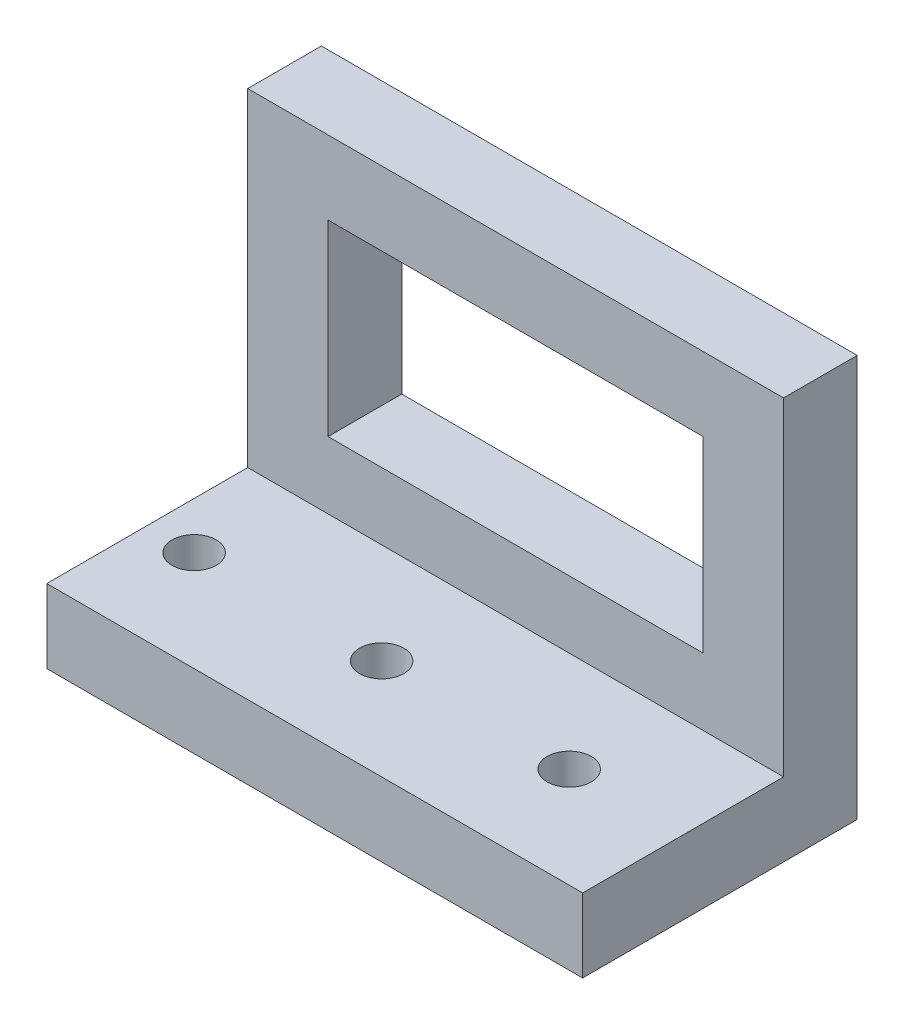
ISO-10303-21;
HEADER;
FILE_DESCRIPTION(('STEP AP214'),'2;1');
FILE_NAME('part.step','',(''),(''),'','','');
FILE_SCHEMA(('AUTOMOTIVE_DESIGN { 1 0 10303 214 1 1 1 1 }'));
ENDSEC;
DATA;
#1=APPLICATION_CONTEXT('core data for automotive mechanical design processes');
#2=APPLICATION_PROTOCOL_DEFINITION('international standard','automotive_design',2000,#1);
#3=PRODUCT_CONTEXT('',#1,'mechanical');
#4=PRODUCT('Part','Part','',(#3));
#5=PRODUCT_RELATED_PRODUCT_CATEGORY('part','',(#4));
#6=PRODUCT_DEFINITION_FORMATION('','',#4);
#7=PRODUCT_DEFINITION_CONTEXT('part definition',#1,'design');
#8=PRODUCT_DEFINITION('design','',#6,#7);
#9=PRODUCT_DEFINITION_SHAPE('','',#8);
#10=(LENGTH_UNIT() NAMED_UNIT(*) SI_UNIT(.MILLI.,.METRE.));
#11=(NAMED_UNIT(*) PLANE_ANGLE_UNIT() SI_UNIT($,.RADIAN.));
#12=(NAMED_UNIT(*) SI_UNIT($,.STERADIAN.) SOLID_ANGLE_UNIT());
#13=UNCERTAINTY_MEASURE_WITH_UNIT(LENGTH_MEASURE(1.E-05),#10,'distance_accuracy_value','');
#14=(GEOMETRIC_REPRESENTATION_CONTEXT(3) GLOBAL_UNCERTAINTY_ASSIGNED_CONTEXT((#13)) GLOBAL_UNIT_ASSIGNED_CONTEXT((#10,
#11,#12)) REPRESENTATION_CONTEXT('',''));
#15=CARTESIAN_POINT('',(0.,0.,0.));
#16=DIRECTION('',(0.,0.,1.));
#17=DIRECTION('',(1.,0.,0.));
#18=AXIS2_PLACEMENT_3D('',#15,#16,#17);
#19=CARTESIAN_POINT('',(-20.2222222222222,10.7222222222222,5.5));
#20=DIRECTION('',(1.,0.,0.));
#21=DIRECTION('',(0.,0.,-1.));
#22=AXIS2_PLACEMENT_3D('',#19,#20,#21);
#23=PLANE('',#22);
#24=DIRECTION('',(0.,-1.,0.));
#25=VECTOR('',#24,1.);
#26=CARTESIAN_POINT('',(-20.2222222222222,10.7222222222222,0.));
#27=LINE('',#26,#25);
#28=CARTESIAN_POINT('',(-20.2222222222222,10.7222222222222,0.));
#29=VERTEX_POINT('',#28);
#30=CARTESIAN_POINT('',(-20.2222222222222,-19.2777777777778,0.));
#31=VERTEX_POINT('',#30);
#32=EDGE_CURVE('E124',#29,#31,#27,.T.);
#33=ORIENTED_EDGE('',*,*,#32,.T.);
#34=DIRECTION('',(0.,0.,-1.));
#35=VECTOR('',#34,1.);
#36=CARTESIAN_POINT('',(-20.2222222222222,-19.2777777777778,5.5));
#37=LINE('',#36,#35);
#38=CARTESIAN_POINT('',(-20.2222222222222,-19.2777777777778,20.5));
#39=VERTEX_POINT('',#38);
#40=EDGE_CURVE('E11',#39,#31,#37,.T.);
#41=ORIENTED_EDGE('',*,*,#40,.F.);
#42=DIRECTION('',(0.,-1.,0.));
#43=VECTOR('',#42,1.);
#44=CARTESIAN_POINT('',(-20.2222222222222,-19.2777777777778,20.5));
#45=LINE('',#44,#43);
#46=CARTESIAN_POINT('',(-20.2222222222222,-13.7777777777778,20.5));
#47=VERTEX_POINT('',#46);
#48=EDGE_CURVE('E121',#47,#39,#45,.T.);
#49=ORIENTED_EDGE('',*,*,#48,.F.);
#50=DIRECTION('',(0.,0.,-1.));
#51=VECTOR('',#50,1.);
#52=CARTESIAN_POINT('',(-20.2222222222222,-13.7777777777778,20.5));
#53=LINE('',#52,#51);
#54=CARTESIAN_POINT('',(-20.2222222222222,-13.7777777777778,5.5));
#55=VERTEX_POINT('',#54);
#56=EDGE_CURVE('E150',#47,#55,#53,.T.);
#57=ORIENTED_EDGE('',*,*,#56,.T.);
#58=DIRECTION('',(0.,-1.,0.));
#59=VECTOR('',#58,1.);
#60=CARTESIAN_POINT('',(-20.2222222222222,10.7222222222222,5.5));
#61=LINE('',#60,#59);
#62=CARTESIAN_POINT('',(-20.2222222222222,10.7222222222222,5.5));
#63=VERTEX_POINT('',#62);
#64=EDGE_CURVE('E200',#63,#55,#61,.T.);
#65=ORIENTED_EDGE('',*,*,#64,.F.);
#66=DIRECTION('',(0.,0.,-1.));
#67=VECTOR('',#66,1.);
#68=CARTESIAN_POINT('',(-20.2222222222222,10.7222222222222,5.5));
#69=LINE('',#68,#67);
#70=EDGE_CURVE('E210',#63,#29,#69,.T.);
#71=ORIENTED_EDGE('',*,*,#70,.T.);
#72=EDGE_LOOP('',(#33,#41,#49,#57,#65,#71));
#73=FACE_BOUND('',#72,.T.);
#74=ADVANCED_FACE('F39',(#73),#23,.F.);
#75=CARTESIAN_POINT('',(-20.2222222222222,-19.2777777777778,5.5));
#76=DIRECTION('',(0.,1.,0.));
#77=DIRECTION('',(0.,0.,1.));
#78=AXIS2_PLACEMENT_3D('',#75,#76,#77);
#79=PLANE('',#78);
#80=CARTESIAN_POINT('',(-16.7222222222222,-19.2777777777778,13.));
#81=DIRECTION('',(0.,-1.,0.));
#82=DIRECTION('',(0.,0.,-1.));
#83=AXIS2_PLACEMENT_3D('',#80,#81,#82);
#84=CIRCLE('',#83,1.65);
#85=CARTESIAN_POINT('',(-16.7222222222222,-19.2777777777778,11.35));
#86=VERTEX_POINT('',#85);
#87=EDGE_CURVE('E233',#86,#86,#84,.T.);
#88=ORIENTED_EDGE('',*,*,#87,.F.);
#89=EDGE_LOOP('',(#88));
#90=FACE_BOUND('',#89,.T.);
#91=CARTESIAN_POINT('',(-2.72222222222221,-19.2777777777778,13.));
#92=DIRECTION('',(0.,-1.,0.));
#93=DIRECTION('',(0.,0.,-1.));
#94=AXIS2_PLACEMENT_3D('',#91,#92,#93);
#95=CIRCLE('',#94,1.65);
#96=CARTESIAN_POINT('',(-2.72222222222221,-19.2777777777778,11.35));
#97=VERTEX_POINT('',#96);
#98=EDGE_CURVE('E328',#97,#97,#95,.T.);
#99=ORIENTED_EDGE('',*,*,#98,.F.);
#100=EDGE_LOOP('',(#99));
#101=FACE_BOUND('',#100,.T.);
#102=CARTESIAN_POINT('',(11.2777777777778,-19.2777777777778,13.));
#103=DIRECTION('',(0.,-1.,0.));
#104=DIRECTION('',(0.,0.,-1.));
#105=AXIS2_PLACEMENT_3D('',#102,#103,#104);
#106=CIRCLE('',#105,1.65);
#107=CARTESIAN_POINT('',(11.2777777777778,-19.2777777777778,11.35));
#108=VERTEX_POINT('',#107);
#109=EDGE_CURVE('E144',#108,#108,#106,.T.);
#110=ORIENTED_EDGE('',*,*,#109,.F.);
#111=EDGE_LOOP('',(#110));
#112=FACE_BOUND('',#111,.T.);
#113=DIRECTION('',(1.,0.,0.));
#114=VECTOR('',#113,1.);
#115=CARTESIAN_POINT('',(-20.2222222222222,-19.2777777777778,0.));
#116=LINE('',#115,#114);
#117=CARTESIAN_POINT('',(19.7777777777778,-19.2777777777778,0.));
#118=VERTEX_POINT('',#117);
#119=EDGE_CURVE('E213',#31,#118,#116,.T.);
#120=ORIENTED_EDGE('',*,*,#119,.T.);
#121=DIRECTION('',(0.,0.,-1.));
#122=VECTOR('',#121,1.);
#123=CARTESIAN_POINT('',(19.7777777777778,-19.2777777777778,5.5));
#124=LINE('',#123,#122);
#125=CARTESIAN_POINT('',(19.7777777777778,-19.2777777777778,20.5));
#126=VERTEX_POINT('',#125);
#127=EDGE_CURVE('E48',#126,#118,#124,.T.);
#128=ORIENTED_EDGE('',*,*,#127,.F.);
#129=DIRECTION('',(1.,0.,0.));
#130=VECTOR('',#129,1.);
#131=CARTESIAN_POINT('',(-20.2222222222222,-19.2777777777778,20.5));
#132=LINE('',#131,#130);
#133=EDGE_CURVE('E127',#39,#126,#132,.T.);
#134=ORIENTED_EDGE('',*,*,#133,.F.);
#135=ORIENTED_EDGE('',*,*,#40,.T.);
#136=EDGE_LOOP('',(#120,#128,#134,#135));
#137=FACE_BOUND('',#136,.T.);
#138=ADVANCED_FACE('F128',(#90,#101,#112,#137),#79,.F.);
#139=CARTESIAN_POINT('',(19.7777777777778,10.7222222222222,5.5));
#140=DIRECTION('',(-1.,0.,0.));
#141=DIRECTION('',(0.,-1.,0.));
#142=AXIS2_PLACEMENT_3D('',#139,#140,#141);
#143=PLANE('',#142);
#144=DIRECTION('',(0.,1.,0.));
#145=VECTOR('',#144,1.);
#146=CARTESIAN_POINT('',(19.7777777777778,10.7222222222222,0.));
#147=LINE('',#146,#145);
#148=CARTESIAN_POINT('',(19.7777777777778,10.7222222222222,0.));
#149=VERTEX_POINT('',#148);
#150=EDGE_CURVE('E216',#118,#149,#147,.T.);
#151=ORIENTED_EDGE('',*,*,#150,.T.);
#152=DIRECTION('',(0.,0.,-1.));
#153=VECTOR('',#152,1.);
#154=CARTESIAN_POINT('',(19.7777777777778,10.7222222222222,5.5));
#155=LINE('',#154,#153);
#156=CARTESIAN_POINT('',(19.7777777777778,10.7222222222222,5.5));
#157=VERTEX_POINT('',#156);
#158=EDGE_CURVE('E223',#157,#149,#155,.T.);
#159=ORIENTED_EDGE('',*,*,#158,.F.);
#160=DIRECTION('',(0.,1.,0.));
#161=VECTOR('',#160,1.);
#162=CARTESIAN_POINT('',(19.7777777777778,10.7222222222222,5.5));
#163=LINE('',#162,#161);
#164=CARTESIAN_POINT('',(19.7777777777778,-13.7777777777778,5.5));
#165=VERTEX_POINT('',#164);
#166=EDGE_CURVE('E203',#165,#157,#163,.T.);
#167=ORIENTED_EDGE('',*,*,#166,.F.);
#168=DIRECTION('',(0.,0.,-1.));
#169=VECTOR('',#168,1.);
#170=CARTESIAN_POINT('',(19.7777777777778,-13.7777777777778,20.5));
#171=LINE('',#170,#169);
#172=CARTESIAN_POINT('',(19.7777777777778,-13.7777777777778,20.5));
#173=VERTEX_POINT('',#172);
#174=EDGE_CURVE('E154',#173,#165,#171,.T.);
#175=ORIENTED_EDGE('',*,*,#174,.F.);
#176=DIRECTION('',(0.,1.,0.));
#177=VECTOR('',#176,1.);
#178=CARTESIAN_POINT('',(19.7777777777778,-19.2777777777778,20.5));
#179=LINE('',#178,#177);
#180=EDGE_CURVE('E133',#126,#173,#179,.T.);
#181=ORIENTED_EDGE('',*,*,#180,.F.);
#182=ORIENTED_EDGE('',*,*,#127,.T.);
#183=EDGE_LOOP('',(#151,#159,#167,#175,#181,#182));
#184=FACE_BOUND('',#183,.T.);
#185=ADVANCED_FACE('F260',(#184),#143,.F.);
#186=CARTESIAN_POINT('',(-20.2222222222222,10.7222222222222,5.5));
#187=DIRECTION('',(0.,-1.,0.));
#188=DIRECTION('',(0.,0.,-1.));
#189=AXIS2_PLACEMENT_3D('',#186,#187,#188);
#190=PLANE('',#189);
#191=DIRECTION('',(-1.,0.,0.));
#192=VECTOR('',#191,1.);
#193=CARTESIAN_POINT('',(-20.2222222222222,10.7222222222222,0.));
#194=LINE('',#193,#192);
#195=EDGE_CURVE('E204',#149,#29,#194,.T.);
#196=ORIENTED_EDGE('',*,*,#195,.T.);
#197=ORIENTED_EDGE('',*,*,#70,.F.);
#198=DIRECTION('',(-1.,0.,0.));
#199=VECTOR('',#198,1.);
#200=CARTESIAN_POINT('',(-20.2222222222222,10.7222222222222,5.5));
#201=LINE('',#200,#199);
#202=EDGE_CURVE('E207',#157,#63,#201,.T.);
#203=ORIENTED_EDGE('',*,*,#202,.F.);
#204=ORIENTED_EDGE('',*,*,#158,.T.);
#205=EDGE_LOOP('',(#196,#197,#203,#204));
#206=FACE_BOUND('',#205,.T.);
#207=ADVANCED_FACE('F265',(#206),#190,.F.);
#208=CARTESIAN_POINT('',(0.,0.,5.5));
#209=DIRECTION('',(0.,0.,1.));
#210=DIRECTION('',(1.,0.,0.));
#211=AXIS2_PLACEMENT_3D('',#208,#209,#210);
#212=PLANE('',#211);
#213=DIRECTION('',(-1.,0.,0.));
#214=VECTOR('',#213,1.);
#215=CARTESIAN_POINT('',(-20.2222222222222,-13.7777777777778,5.5));
#216=LINE('',#215,#214);
#217=EDGE_CURVE('E56',#165,#55,#216,.T.);
#218=ORIENTED_EDGE('',*,*,#217,.F.);
#219=ORIENTED_EDGE('',*,*,#166,.T.);
#220=ORIENTED_EDGE('',*,*,#202,.T.);
#221=ORIENTED_EDGE('',*,*,#64,.T.);
#222=EDGE_LOOP('',(#218,#219,#220,#221));
#223=FACE_BOUND('',#222,.T.);
#224=DIRECTION('',(1.,0.,0.));
#225=VECTOR('',#224,1.);
#226=CARTESIAN_POINT('',(-14.2222222222222,-8.77777777777778,5.5));
#227=LINE('',#226,#225);
#228=CARTESIAN_POINT('',(-14.2222222222222,-8.77777777777778,5.5));
#229=VERTEX_POINT('',#228);
#230=CARTESIAN_POINT('',(13.7777777777778,-8.77777777777778,5.5));
#231=VERTEX_POINT('',#230);
#232=EDGE_CURVE('E64',#229,#231,#227,.T.);
#233=ORIENTED_EDGE('',*,*,#232,.F.);
#234=DIRECTION('',(0.,-1.,0.));
#235=VECTOR('',#234,1.);
#236=CARTESIAN_POINT('',(-14.2222222222222,-8.77777777777778,5.5));
#237=LINE('',#236,#235);
#238=CARTESIAN_POINT('',(-14.2222222222222,5.22222222222222,5.5));
#239=VERTEX_POINT('',#238);
#240=EDGE_CURVE('E163',#239,#229,#237,.T.);
#241=ORIENTED_EDGE('',*,*,#240,.F.);
#242=DIRECTION('',(-1.,0.,0.));
#243=VECTOR('',#242,1.);
#244=CARTESIAN_POINT('',(-14.2222222222222,5.22222222222222,5.5));
#245=LINE('',#244,#243);
#246=CARTESIAN_POINT('',(13.7777777777778,5.22222222222222,5.5));
#247=VERTEX_POINT('',#246);
#248=EDGE_CURVE('E182',#247,#239,#245,.T.);
#249=ORIENTED_EDGE('',*,*,#248,.F.);
#250=DIRECTION('',(0.,1.,0.));
#251=VECTOR('',#250,1.);
#252=CARTESIAN_POINT('',(13.7777777777778,-8.77777777777778,5.5));
#253=LINE('',#252,#251);
#254=EDGE_CURVE('E178',#231,#247,#253,.T.);
#255=ORIENTED_EDGE('',*,*,#254,.F.);
#256=EDGE_LOOP('',(#233,#241,#249,#255));
#257=FACE_BOUND('',#256,.T.);
#258=ADVANCED_FACE('F273',(#223,#257),#212,.T.);
#259=CARTESIAN_POINT('',(0.,0.,0.));
#260=DIRECTION('',(0.,0.,1.));
#261=DIRECTION('',(1.,0.,0.));
#262=AXIS2_PLACEMENT_3D('',#259,#260,#261);
#263=PLANE('',#262);
#264=DIRECTION('',(0.,-1.,0.));
#265=VECTOR('',#264,1.);
#266=CARTESIAN_POINT('',(-14.2222222222222,-8.77777777777778,0.));
#267=LINE('',#266,#265);
#268=CARTESIAN_POINT('',(-14.2222222222222,5.22222222222222,0.));
#269=VERTEX_POINT('',#268);
#270=CARTESIAN_POINT('',(-14.2222222222222,-8.77777777777778,0.));
#271=VERTEX_POINT('',#270);
#272=EDGE_CURVE('E171',#269,#271,#267,.T.);
#273=ORIENTED_EDGE('',*,*,#272,.T.);
#274=DIRECTION('',(1.,0.,0.));
#275=VECTOR('',#274,1.);
#276=CARTESIAN_POINT('',(-14.2222222222222,-8.77777777777778,0.));
#277=LINE('',#276,#275);
#278=CARTESIAN_POINT('',(13.7777777777778,-8.77777777777778,0.));
#279=VERTEX_POINT('',#278);
#280=EDGE_CURVE('E158',#271,#279,#277,.T.);
#281=ORIENTED_EDGE('',*,*,#280,.T.);
#282=DIRECTION('',(0.,1.,0.));
#283=VECTOR('',#282,1.);
#284=CARTESIAN_POINT('',(13.7777777777778,-8.77777777777778,0.));
#285=LINE('',#284,#283);
#286=CARTESIAN_POINT('',(13.7777777777778,5.22222222222222,0.));
#287=VERTEX_POINT('',#286);
#288=EDGE_CURVE('E162',#279,#287,#285,.T.);
#289=ORIENTED_EDGE('',*,*,#288,.T.);
#290=DIRECTION('',(-1.,0.,0.));
#291=VECTOR('',#290,1.);
#292=CARTESIAN_POINT('',(-14.2222222222222,5.22222222222222,0.));
#293=LINE('',#292,#291);
#294=EDGE_CURVE('E167',#287,#269,#293,.T.);
#295=ORIENTED_EDGE('',*,*,#294,.T.);
#296=EDGE_LOOP('',(#273,#281,#289,#295));
#297=FACE_BOUND('',#296,.T.);
#298=ORIENTED_EDGE('',*,*,#32,.F.);
#299=ORIENTED_EDGE('',*,*,#195,.F.);
#300=ORIENTED_EDGE('',*,*,#150,.F.);
#301=ORIENTED_EDGE('',*,*,#119,.F.);
#302=EDGE_LOOP('',(#298,#299,#300,#301));
#303=FACE_BOUND('',#302,.T.);
#304=ADVANCED_FACE('F275',(#297,#303),#263,.F.);
#305=CARTESIAN_POINT('',(-14.2222222222222,-8.77777777777778,0.));
#306=DIRECTION('',(0.,-1.,0.));
#307=DIRECTION('',(0.,0.,-1.));
#308=AXIS2_PLACEMENT_3D('',#305,#306,#307);
#309=PLANE('',#308);
#310=ORIENTED_EDGE('',*,*,#232,.T.);
#311=DIRECTION('',(0.,0.,1.));
#312=VECTOR('',#311,1.);
#313=CARTESIAN_POINT('',(13.7777777777778,-8.77777777777778,0.));
#314=LINE('',#313,#312);
#315=EDGE_CURVE('E175',#279,#231,#314,.T.);
#316=ORIENTED_EDGE('',*,*,#315,.F.);
#317=ORIENTED_EDGE('',*,*,#280,.F.);
#318=DIRECTION('',(0.,0.,1.));
#319=VECTOR('',#318,1.);
#320=CARTESIAN_POINT('',(-14.2222222222222,-8.77777777777778,0.));
#321=LINE('',#320,#319);
#322=EDGE_CURVE('E189',#271,#229,#321,.T.);
#323=ORIENTED_EDGE('',*,*,#322,.T.);
#324=EDGE_LOOP('',(#310,#316,#317,#323));
#325=FACE_BOUND('',#324,.T.);
#326=ADVANCED_FACE('F278',(#325),#309,.F.);
#327=CARTESIAN_POINT('',(-14.2222222222222,-8.77777777777778,0.));
#328=DIRECTION('',(-1.,0.,0.));
#329=DIRECTION('',(0.,0.,1.));
#330=AXIS2_PLACEMENT_3D('',#327,#328,#329);
#331=PLANE('',#330);
#332=ORIENTED_EDGE('',*,*,#240,.T.);
#333=ORIENTED_EDGE('',*,*,#322,.F.);
#334=ORIENTED_EDGE('',*,*,#272,.F.);
#335=DIRECTION('',(0.,0.,1.));
#336=VECTOR('',#335,1.);
#337=CARTESIAN_POINT('',(-14.2222222222222,5.22222222222222,0.));
#338=LINE('',#337,#336);
#339=EDGE_CURVE('E192',#269,#239,#338,.T.);
#340=ORIENTED_EDGE('',*,*,#339,.T.);
#341=EDGE_LOOP('',(#332,#333,#334,#340));
#342=FACE_BOUND('',#341,.T.);
#343=ADVANCED_FACE('F284',(#342),#331,.F.);
#344=CARTESIAN_POINT('',(-14.2222222222222,5.22222222222222,0.));
#345=DIRECTION('',(0.,1.,0.));
#346=DIRECTION('',(0.,0.,1.));
#347=AXIS2_PLACEMENT_3D('',#344,#345,#346);
#348=PLANE('',#347);
#349=ORIENTED_EDGE('',*,*,#248,.T.);
#350=ORIENTED_EDGE('',*,*,#339,.F.);
#351=ORIENTED_EDGE('',*,*,#294,.F.);
#352=DIRECTION('',(0.,0.,1.));
#353=VECTOR('',#352,1.);
#354=CARTESIAN_POINT('',(13.7777777777778,5.22222222222222,0.));
#355=LINE('',#354,#353);
#356=EDGE_CURVE('E195',#287,#247,#355,.T.);
#357=ORIENTED_EDGE('',*,*,#356,.T.);
#358=EDGE_LOOP('',(#349,#350,#351,#357));
#359=FACE_BOUND('',#358,.T.);
#360=ADVANCED_FACE('F288',(#359),#348,.F.);
#361=CARTESIAN_POINT('',(13.7777777777778,-8.77777777777778,0.));
#362=DIRECTION('',(1.,0.,0.));
#363=DIRECTION('',(0.,0.,-1.));
#364=AXIS2_PLACEMENT_3D('',#361,#362,#363);
#365=PLANE('',#364);
#366=ORIENTED_EDGE('',*,*,#254,.T.);
#367=ORIENTED_EDGE('',*,*,#356,.F.);
#368=ORIENTED_EDGE('',*,*,#288,.F.);
#369=ORIENTED_EDGE('',*,*,#315,.T.);
#370=EDGE_LOOP('',(#366,#367,#368,#369));
#371=FACE_BOUND('',#370,.T.);
#372=ADVANCED_FACE('F285',(#371),#365,.F.);
#373=CARTESIAN_POINT('',(-20.2222222222222,-13.7777777777778,20.5));
#374=DIRECTION('',(0.,-1.,0.));
#375=DIRECTION('',(0.,0.,-1.));
#376=AXIS2_PLACEMENT_3D('',#373,#374,#375);
#377=PLANE('',#376);
#378=CARTESIAN_POINT('',(-16.7222222222222,-13.7777777777778,13.));
#379=DIRECTION('',(0.,-1.,0.));
#380=DIRECTION('',(0.,0.,-1.));
#381=AXIS2_PLACEMENT_3D('',#378,#379,#380);
#382=CIRCLE('',#381,1.65);
#383=CARTESIAN_POINT('',(-16.7222222222222,-13.7777777777778,11.35));
#384=VERTEX_POINT('',#383);
#385=EDGE_CURVE('E42',#384,#384,#382,.T.);
#386=ORIENTED_EDGE('',*,*,#385,.T.);
#387=EDGE_LOOP('',(#386));
#388=FACE_BOUND('',#387,.T.);
#389=CARTESIAN_POINT('',(-2.72222222222221,-13.7777777777778,13.));
#390=DIRECTION('',(0.,-1.,0.));
#391=DIRECTION('',(0.,0.,-1.));
#392=AXIS2_PLACEMENT_3D('',#389,#390,#391);
#393=CIRCLE('',#392,1.65);
#394=CARTESIAN_POINT('',(-2.72222222222221,-13.7777777777778,11.35));
#395=VERTEX_POINT('',#394);
#396=EDGE_CURVE('E232',#395,#395,#393,.T.);
#397=ORIENTED_EDGE('',*,*,#396,.T.);
#398=EDGE_LOOP('',(#397));
#399=FACE_BOUND('',#398,.T.);
#400=CARTESIAN_POINT('',(11.2777777777778,-13.7777777777778,13.));
#401=DIRECTION('',(0.,-1.,0.));
#402=DIRECTION('',(0.,0.,-1.));
#403=AXIS2_PLACEMENT_3D('',#400,#401,#402);
#404=CIRCLE('',#403,1.65);
#405=CARTESIAN_POINT('',(11.2777777777778,-13.7777777777778,11.35));
#406=VERTEX_POINT('',#405);
#407=EDGE_CURVE('E229',#406,#406,#404,.T.);
#408=ORIENTED_EDGE('',*,*,#407,.T.);
#409=EDGE_LOOP('',(#408));
#410=FACE_BOUND('',#409,.T.);
#411=ORIENTED_EDGE('',*,*,#217,.T.);
#412=ORIENTED_EDGE('',*,*,#56,.F.);
#413=DIRECTION('',(-1.,0.,0.));
#414=VECTOR('',#413,1.);
#415=CARTESIAN_POINT('',(-20.2222222222222,-13.7777777777778,20.5));
#416=LINE('',#415,#414);
#417=EDGE_CURVE('E137',#173,#47,#416,.T.);
#418=ORIENTED_EDGE('',*,*,#417,.F.);
#419=ORIENTED_EDGE('',*,*,#174,.T.);
#420=EDGE_LOOP('',(#411,#412,#418,#419));
#421=FACE_BOUND('',#420,.T.);
#422=ADVANCED_FACE('F242',(#388,#399,#410,#421),#377,.F.);
#423=CARTESIAN_POINT('',(0.,0.,20.5));
#424=DIRECTION('',(0.,0.,-1.));
#425=DIRECTION('',(-1.,0.,0.));
#426=AXIS2_PLACEMENT_3D('',#423,#424,#425);
#427=PLANE('',#426);
#428=ORIENTED_EDGE('',*,*,#48,.T.);
#429=ORIENTED_EDGE('',*,*,#133,.T.);
#430=ORIENTED_EDGE('',*,*,#180,.T.);
#431=ORIENTED_EDGE('',*,*,#417,.T.);
#432=EDGE_LOOP('',(#428,#429,#430,#431));
#433=FACE_BOUND('',#432,.T.);
#434=ADVANCED_FACE('F135',(#433),#427,.F.);
#435=CARTESIAN_POINT('',(11.2777777777778,-4.27777777777778,13.));
#436=DIRECTION('',(0.,-1.,0.));
#437=DIRECTION('',(0.,0.,-1.));
#438=AXIS2_PLACEMENT_3D('',#435,#436,#437);
#439=CYLINDRICAL_SURFACE('',#438,1.65);
#440=ORIENTED_EDGE('',*,*,#109,.T.);
#441=EDGE_LOOP('',(#440));
#442=FACE_BOUND('',#441,.T.);
#443=ORIENTED_EDGE('',*,*,#407,.F.);
#444=EDGE_LOOP('',(#443));
#445=FACE_BOUND('',#444,.T.);
#446=ADVANCED_FACE('F252',(#442,#445),#439,.F.);
#447=CARTESIAN_POINT('',(-2.72222222222221,-4.27777777777778,13.));
#448=DIRECTION('',(0.,-1.,0.));
#449=DIRECTION('',(0.,0.,-1.));
#450=AXIS2_PLACEMENT_3D('',#447,#448,#449);
#451=CYLINDRICAL_SURFACE('',#450,1.65);
#452=ORIENTED_EDGE('',*,*,#98,.T.);
#453=EDGE_LOOP('',(#452));
#454=FACE_BOUND('',#453,.T.);
#455=ORIENTED_EDGE('',*,*,#396,.F.);
#456=EDGE_LOOP('',(#455));
#457=FACE_BOUND('',#456,.T.);
#458=ADVANCED_FACE('F246',(#454,#457),#451,.F.);
#459=CARTESIAN_POINT('',(-16.7222222222222,-4.27777777777778,13.));
#460=DIRECTION('',(0.,-1.,0.));
#461=DIRECTION('',(0.,0.,-1.));
#462=AXIS2_PLACEMENT_3D('',#459,#460,#461);
#463=CYLINDRICAL_SURFACE('',#462,1.65);
#464=ORIENTED_EDGE('',*,*,#87,.T.);
#465=EDGE_LOOP('',(#464));
#466=FACE_BOUND('',#465,.T.);
#467=ORIENTED_EDGE('',*,*,#385,.F.);
#468=EDGE_LOOP('',(#467));
#469=FACE_BOUND('',#468,.T.);
#470=ADVANCED_FACE('F244',(#466,#469),#463,.F.);
#471=CLOSED_SHELL('',(#74,#138,#185,#207,#258,#304,#326,#343,#360,#372,#422,#434,#446,#458,#470));
#472=MANIFOLD_SOLID_BREP('B2',#471);
#473=ADVANCED_BREP_SHAPE_REPRESENTATION('',(#18,#472),#14);
#474=SHAPE_DEFINITION_REPRESENTATION(#9,#473);
ENDSEC;
END-ISO-10303-21;
